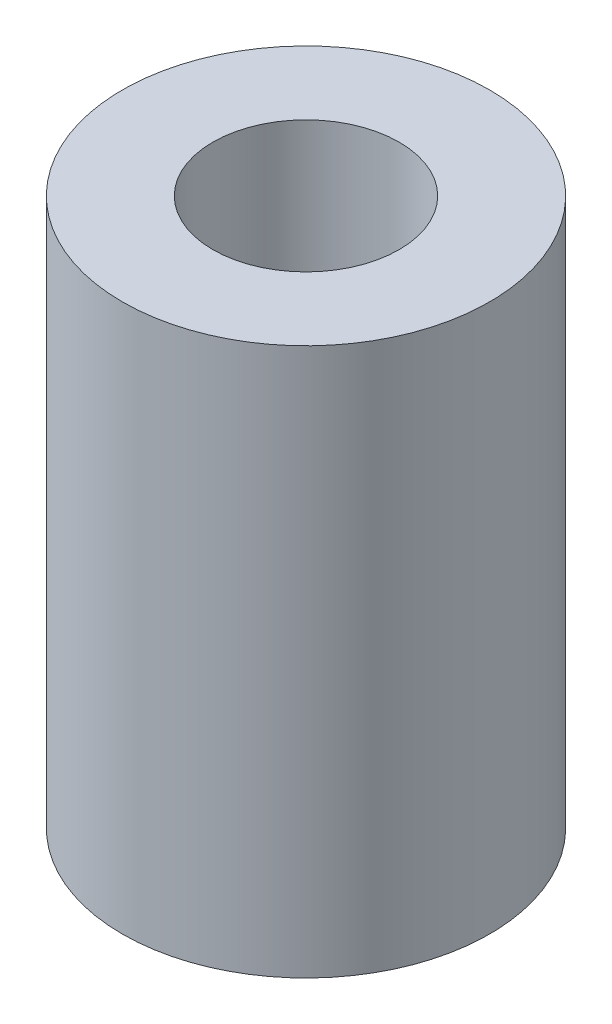
ISO-10303-21;
HEADER;
FILE_DESCRIPTION(('STEP AP214'),'2;1');
FILE_NAME('part.step','',(''),(''),'','','');
FILE_SCHEMA(('AUTOMOTIVE_DESIGN { 1 0 10303 214 1 1 1 1 }'));
ENDSEC;
DATA;
#1=APPLICATION_CONTEXT('core data for automotive mechanical design processes');
#2=APPLICATION_PROTOCOL_DEFINITION('international standard','automotive_design',2000,#1);
#3=PRODUCT_CONTEXT('',#1,'mechanical');
#4=PRODUCT('Part','Part','',(#3));
#5=PRODUCT_RELATED_PRODUCT_CATEGORY('part','',(#4));
#6=PRODUCT_DEFINITION_FORMATION('','',#4);
#7=PRODUCT_DEFINITION_CONTEXT('part definition',#1,'design');
#8=PRODUCT_DEFINITION('design','',#6,#7);
#9=PRODUCT_DEFINITION_SHAPE('','',#8);
#10=(LENGTH_UNIT() NAMED_UNIT(*) SI_UNIT(.MILLI.,.METRE.));
#11=(NAMED_UNIT(*) PLANE_ANGLE_UNIT() SI_UNIT($,.RADIAN.));
#12=(NAMED_UNIT(*) SI_UNIT($,.STERADIAN.) SOLID_ANGLE_UNIT());
#13=UNCERTAINTY_MEASURE_WITH_UNIT(LENGTH_MEASURE(1.E-05),#10,'distance_accuracy_value','');
#14=(GEOMETRIC_REPRESENTATION_CONTEXT(3) GLOBAL_UNCERTAINTY_ASSIGNED_CONTEXT((#13)) GLOBAL_UNIT_ASSIGNED_CONTEXT((#10,
#11,#12)) REPRESENTATION_CONTEXT('',''));
#15=CARTESIAN_POINT('',(0.,0.,0.));
#16=DIRECTION('',(0.,0.,1.));
#17=DIRECTION('',(1.,0.,0.));
#18=AXIS2_PLACEMENT_3D('',#15,#16,#17);
#19=CARTESIAN_POINT('',(0.,54.63,0.));
#20=DIRECTION('',(0.,1.,0.));
#21=DIRECTION('',(0.,0.,1.));
#22=AXIS2_PLACEMENT_3D('',#19,#20,#21);
#23=PLANE('',#22);
#24=CARTESIAN_POINT('',(0.,54.63,0.));
#25=DIRECTION('',(0.,1.,0.));
#26=DIRECTION('',(0.,0.,1.));
#27=AXIS2_PLACEMENT_3D('',#24,#25,#26);
#28=CIRCLE('',#27,18.32);
#29=CARTESIAN_POINT('',(0.,54.63,18.32));
#30=VERTEX_POINT('',#29);
#31=EDGE_CURVE('E12',#30,#30,#28,.T.);
#32=ORIENTED_EDGE('',*,*,#31,.T.);
#33=EDGE_LOOP('',(#32));
#34=FACE_BOUND('',#33,.T.);
#35=CARTESIAN_POINT('',(0.,54.63,0.));
#36=DIRECTION('',(0.,1.,0.));
#37=DIRECTION('',(0.,0.,1.));
#38=AXIS2_PLACEMENT_3D('',#35,#36,#37);
#39=CIRCLE('',#38,9.295);
#40=CARTESIAN_POINT('',(0.,54.63,9.29500000000002));
#41=VERTEX_POINT('',#40);
#42=EDGE_CURVE('E54',#41,#41,#39,.T.);
#43=ORIENTED_EDGE('',*,*,#42,.F.);
#44=EDGE_LOOP('',(#43));
#45=FACE_BOUND('',#44,.T.);
#46=ADVANCED_FACE('F43',(#34,#45),#23,.T.);
#47=CARTESIAN_POINT('',(0.,0.,0.));
#48=DIRECTION('',(0.,1.,0.));
#49=DIRECTION('',(0.,0.,1.));
#50=AXIS2_PLACEMENT_3D('',#47,#48,#49);
#51=PLANE('',#50);
#52=CARTESIAN_POINT('',(0.,0.,0.));
#53=DIRECTION('',(0.,1.,0.));
#54=DIRECTION('',(0.,0.,1.));
#55=AXIS2_PLACEMENT_3D('',#52,#53,#54);
#56=CIRCLE('',#55,18.32);
#57=CARTESIAN_POINT('',(0.,0.,18.32));
#58=VERTEX_POINT('',#57);
#59=EDGE_CURVE('E47',#58,#58,#56,.T.);
#60=ORIENTED_EDGE('',*,*,#59,.F.);
#61=EDGE_LOOP('',(#60));
#62=FACE_BOUND('',#61,.T.);
#63=CARTESIAN_POINT('',(0.,0.,0.));
#64=DIRECTION('',(0.,1.,0.));
#65=DIRECTION('',(0.,0.,1.));
#66=AXIS2_PLACEMENT_3D('',#63,#64,#65);
#67=CIRCLE('',#66,9.295);
#68=CARTESIAN_POINT('',(0.,0.,9.29500000000002));
#69=VERTEX_POINT('',#68);
#70=EDGE_CURVE('E56',#69,#69,#67,.T.);
#71=ORIENTED_EDGE('',*,*,#70,.T.);
#72=EDGE_LOOP('',(#71));
#73=FACE_BOUND('',#72,.T.);
#74=ADVANCED_FACE('F66',(#62,#73),#51,.F.);
#75=CARTESIAN_POINT('',(0.,54.63,0.));
#76=DIRECTION('',(0.,-1.,0.));
#77=DIRECTION('',(0.,0.,-1.));
#78=AXIS2_PLACEMENT_3D('',#75,#76,#77);
#79=CYLINDRICAL_SURFACE('',#78,18.32);
#80=ORIENTED_EDGE('',*,*,#31,.F.);
#81=EDGE_LOOP('',(#80));
#82=FACE_BOUND('',#81,.T.);
#83=ORIENTED_EDGE('',*,*,#59,.T.);
#84=EDGE_LOOP('',(#83));
#85=FACE_BOUND('',#84,.T.);
#86=ADVANCED_FACE('F45',(#82,#85),#79,.T.);
#87=CARTESIAN_POINT('',(0.,54.63,0.));
#88=DIRECTION('',(0.,-1.,0.));
#89=DIRECTION('',(0.,0.,-1.));
#90=AXIS2_PLACEMENT_3D('',#87,#88,#89);
#91=CYLINDRICAL_SURFACE('',#90,9.295);
#92=ORIENTED_EDGE('',*,*,#42,.T.);
#93=EDGE_LOOP('',(#92));
#94=FACE_BOUND('',#93,.T.);
#95=ORIENTED_EDGE('',*,*,#70,.F.);
#96=EDGE_LOOP('',(#95));
#97=FACE_BOUND('',#96,.T.);
#98=ADVANCED_FACE('F62',(#94,#97),#91,.F.);
#99=CLOSED_SHELL('',(#46,#74,#86,#98));
#100=MANIFOLD_SOLID_BREP('B2',#99);
#101=ADVANCED_BREP_SHAPE_REPRESENTATION('',(#18,#100),#14);
#102=SHAPE_DEFINITION_REPRESENTATION(#9,#101);
ENDSEC;
END-ISO-10303-21;
